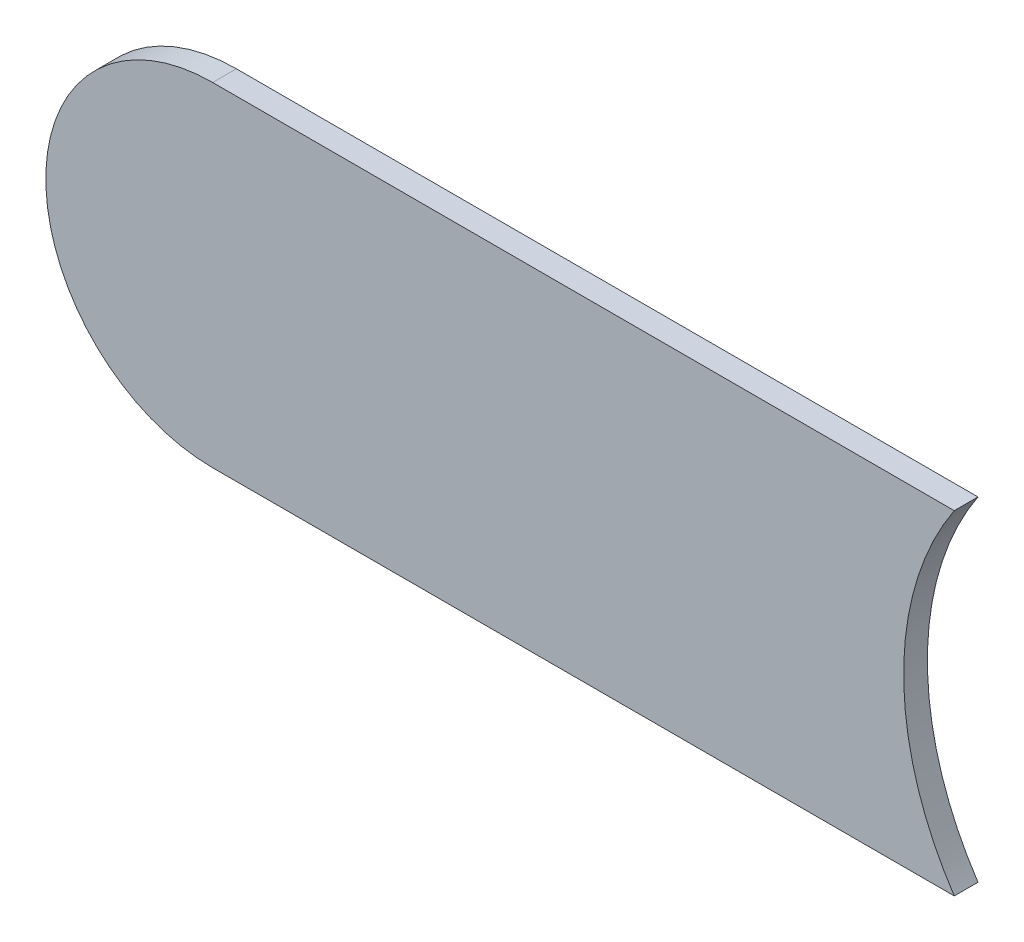
ISO-10303-21;
HEADER;
FILE_DESCRIPTION(('STEP AP214'),'2;1');
FILE_NAME('part.step','',(''),(''),'','','');
FILE_SCHEMA(('AUTOMOTIVE_DESIGN { 1 0 10303 214 1 1 1 1 }'));
ENDSEC;
DATA;
#1=APPLICATION_CONTEXT('core data for automotive mechanical design processes');
#2=APPLICATION_PROTOCOL_DEFINITION('international standard','automotive_design',2000,#1);
#3=PRODUCT_CONTEXT('',#1,'mechanical');
#4=PRODUCT('Part','Part','',(#3));
#5=PRODUCT_RELATED_PRODUCT_CATEGORY('part','',(#4));
#6=PRODUCT_DEFINITION_FORMATION('','',#4);
#7=PRODUCT_DEFINITION_CONTEXT('part definition',#1,'design');
#8=PRODUCT_DEFINITION('design','',#6,#7);
#9=PRODUCT_DEFINITION_SHAPE('','',#8);
#10=(LENGTH_UNIT() NAMED_UNIT(*) SI_UNIT(.MILLI.,.METRE.));
#11=(NAMED_UNIT(*) PLANE_ANGLE_UNIT() SI_UNIT($,.RADIAN.));
#12=(NAMED_UNIT(*) SI_UNIT($,.STERADIAN.) SOLID_ANGLE_UNIT());
#13=UNCERTAINTY_MEASURE_WITH_UNIT(LENGTH_MEASURE(1.E-05),#10,'distance_accuracy_value','');
#14=(GEOMETRIC_REPRESENTATION_CONTEXT(3) GLOBAL_UNCERTAINTY_ASSIGNED_CONTEXT((#13)) GLOBAL_UNIT_ASSIGNED_CONTEXT((#10,
#11,#12)) REPRESENTATION_CONTEXT('',''));
#15=CARTESIAN_POINT('',(0.,0.,0.));
#16=DIRECTION('',(0.,0.,1.));
#17=DIRECTION('',(1.,0.,0.));
#18=AXIS2_PLACEMENT_3D('',#15,#16,#17);
#19=CARTESIAN_POINT('',(88.9145796,87.7099973,0.));
#20=DIRECTION('',(0.,1.,0.));
#21=DIRECTION('',(1.,0.,0.));
#22=AXIS2_PLACEMENT_3D('',#19,#20,#21);
#23=PLANE('',#22);
#24=DIRECTION('',(1.,0.,0.));
#25=VECTOR('',#24,1.);
#26=CARTESIAN_POINT('',(88.9145796,87.7099973,0.03556));
#27=LINE('',#26,#25);
#28=CARTESIAN_POINT('',(88.9145796,87.7099973,0.03556));
#29=VERTEX_POINT('',#28);
#30=CARTESIAN_POINT('',(90.0258574096541,87.7099973,0.03556));
#31=VERTEX_POINT('',#30);
#32=EDGE_CURVE('E11',#29,#31,#27,.T.);
#33=ORIENTED_EDGE('',*,*,#32,.F.);
#34=DIRECTION('',(0.,0.,1.));
#35=VECTOR('',#34,1.);
#36=CARTESIAN_POINT('',(88.9145796,87.7099973,0.));
#37=LINE('',#36,#35);
#38=CARTESIAN_POINT('',(88.9145796,87.7099973,0.));
#39=VERTEX_POINT('',#38);
#40=EDGE_CURVE('E24',#39,#29,#37,.T.);
#41=ORIENTED_EDGE('',*,*,#40,.F.);
#42=DIRECTION('',(1.,0.,0.));
#43=VECTOR('',#42,1.);
#44=CARTESIAN_POINT('',(88.9145796,87.7099973,0.));
#45=LINE('',#44,#43);
#46=CARTESIAN_POINT('',(90.0258574096541,87.7099973,0.));
#47=VERTEX_POINT('',#46);
#48=EDGE_CURVE('E75',#39,#47,#45,.T.);
#49=ORIENTED_EDGE('',*,*,#48,.T.);
#50=DIRECTION('',(0.,0.,1.));
#51=VECTOR('',#50,1.);
#52=CARTESIAN_POINT('',(90.0258574096541,87.7099973,0.));
#53=LINE('',#52,#51);
#54=EDGE_CURVE('E37',#47,#31,#53,.T.);
#55=ORIENTED_EDGE('',*,*,#54,.T.);
#56=EDGE_LOOP('',(#33,#41,#49,#55));
#57=FACE_BOUND('',#56,.T.);
#58=ADVANCED_FACE('F17',(#57),#23,.F.);
#59=CARTESIAN_POINT('',(90.4000224,87.9599968,0.));
#60=DIRECTION('',(0.,0.,-1.));
#61=DIRECTION('',(1.,0.,0.));
#62=AXIS2_PLACEMENT_3D('',#59,#60,#61);
#63=CYLINDRICAL_SURFACE('',#62,0.4499991);
#64=DIRECTION('',(0.,0.,1.));
#65=VECTOR('',#64,1.);
#66=CARTESIAN_POINT('',(90.0258574096541,88.2099963,0.));
#67=LINE('',#66,#65);
#68=CARTESIAN_POINT('',(90.0258574096541,88.2099963,0.));
#69=VERTEX_POINT('',#68);
#70=CARTESIAN_POINT('',(90.0258574096541,88.2099963,0.03556));
#71=VERTEX_POINT('',#70);
#72=EDGE_CURVE('E67',#69,#71,#67,.T.);
#73=ORIENTED_EDGE('',*,*,#72,.T.);
#74=CARTESIAN_POINT('',(90.4000224,87.9599968,0.03556));
#75=DIRECTION('',(0.,0.,1.));
#76=DIRECTION('',(1.,0.,0.));
#77=AXIS2_PLACEMENT_3D('',#74,#75,#76);
#78=CIRCLE('',#77,0.4499991);
#79=EDGE_CURVE('E82',#71,#31,#78,.T.);
#80=ORIENTED_EDGE('',*,*,#79,.T.);
#81=ORIENTED_EDGE('',*,*,#54,.F.);
#82=CARTESIAN_POINT('',(90.4000224,87.9599968,0.));
#83=DIRECTION('',(0.,0.,1.));
#84=DIRECTION('',(1.,0.,0.));
#85=AXIS2_PLACEMENT_3D('',#82,#83,#84);
#86=CIRCLE('',#85,0.4499991);
#87=EDGE_CURVE('E80',#69,#47,#86,.T.);
#88=ORIENTED_EDGE('',*,*,#87,.F.);
#89=EDGE_LOOP('',(#73,#80,#81,#88));
#90=FACE_BOUND('',#89,.T.);
#91=ADVANCED_FACE('F88',(#90),#63,.F.);
#92=CARTESIAN_POINT('',(90.0258574096541,88.2099963,0.));
#93=DIRECTION('',(0.,-1.,0.));
#94=DIRECTION('',(-1.,0.,0.));
#95=AXIS2_PLACEMENT_3D('',#92,#93,#94);
#96=PLANE('',#95);
#97=DIRECTION('',(-1.,0.,0.));
#98=VECTOR('',#97,1.);
#99=CARTESIAN_POINT('',(90.4000224,88.2099963,0.03556));
#100=LINE('',#99,#98);
#101=CARTESIAN_POINT('',(88.9145796,88.2099963,0.03556));
#102=VERTEX_POINT('',#101);
#103=EDGE_CURVE('E71',#71,#102,#100,.T.);
#104=ORIENTED_EDGE('',*,*,#103,.F.);
#105=ORIENTED_EDGE('',*,*,#72,.F.);
#106=DIRECTION('',(-1.,0.,0.));
#107=VECTOR('',#106,1.);
#108=CARTESIAN_POINT('',(90.4000224,88.2099963,0.));
#109=LINE('',#108,#107);
#110=CARTESIAN_POINT('',(88.9145796,88.2099963,0.));
#111=VERTEX_POINT('',#110);
#112=EDGE_CURVE('E63',#69,#111,#109,.T.);
#113=ORIENTED_EDGE('',*,*,#112,.T.);
#114=DIRECTION('',(0.,0.,1.));
#115=VECTOR('',#114,1.);
#116=CARTESIAN_POINT('',(88.9145796,88.2099963,0.));
#117=LINE('',#116,#115);
#118=EDGE_CURVE('E53',#111,#102,#117,.T.);
#119=ORIENTED_EDGE('',*,*,#118,.T.);
#120=EDGE_LOOP('',(#104,#105,#113,#119));
#121=FACE_BOUND('',#120,.T.);
#122=ADVANCED_FACE('F66',(#121),#96,.F.);
#123=CARTESIAN_POINT('',(88.9145796,87.9599968,0.));
#124=DIRECTION('',(0.,0.,-1.));
#125=DIRECTION('',(0.,1.,0.));
#126=AXIS2_PLACEMENT_3D('',#123,#124,#125);
#127=CYLINDRICAL_SURFACE('',#126,0.249999500000001);
#128=CARTESIAN_POINT('',(88.9145796,87.9599968,0.03556));
#129=DIRECTION('',(0.,0.,1.));
#130=DIRECTION('',(0.,1.,0.));
#131=AXIS2_PLACEMENT_3D('',#128,#129,#130);
#132=CIRCLE('',#131,0.249999500000001);
#133=EDGE_CURVE('E59',#102,#29,#132,.T.);
#134=ORIENTED_EDGE('',*,*,#133,.F.);
#135=ORIENTED_EDGE('',*,*,#118,.F.);
#136=CARTESIAN_POINT('',(88.9145796,87.9599968,0.));
#137=DIRECTION('',(0.,0.,1.));
#138=DIRECTION('',(0.,1.,0.));
#139=AXIS2_PLACEMENT_3D('',#136,#137,#138);
#140=CIRCLE('',#139,0.249999500000001);
#141=EDGE_CURVE('E57',#111,#39,#140,.T.);
#142=ORIENTED_EDGE('',*,*,#141,.T.);
#143=ORIENTED_EDGE('',*,*,#40,.T.);
#144=EDGE_LOOP('',(#134,#135,#142,#143));
#145=FACE_BOUND('',#144,.T.);
#146=ADVANCED_FACE('F55',(#145),#127,.T.);
#147=CARTESIAN_POINT('',(88.9145796,87.7099973,0.));
#148=DIRECTION('',(0.,0.,-1.));
#149=DIRECTION('',(-1.,0.,0.));
#150=AXIS2_PLACEMENT_3D('',#147,#148,#149);
#151=PLANE('',#150);
#152=ORIENTED_EDGE('',*,*,#48,.F.);
#153=ORIENTED_EDGE('',*,*,#141,.F.);
#154=ORIENTED_EDGE('',*,*,#112,.F.);
#155=ORIENTED_EDGE('',*,*,#87,.T.);
#156=EDGE_LOOP('',(#152,#153,#154,#155));
#157=FACE_BOUND('',#156,.T.);
#158=ADVANCED_FACE('F74',(#157),#151,.T.);
#159=CARTESIAN_POINT('',(88.9145796,87.7099973,0.03556));
#160=DIRECTION('',(0.,0.,-1.));
#161=DIRECTION('',(-1.,0.,0.));
#162=AXIS2_PLACEMENT_3D('',#159,#160,#161);
#163=PLANE('',#162);
#164=ORIENTED_EDGE('',*,*,#133,.T.);
#165=ORIENTED_EDGE('',*,*,#32,.T.);
#166=ORIENTED_EDGE('',*,*,#79,.F.);
#167=ORIENTED_EDGE('',*,*,#103,.T.);
#168=EDGE_LOOP('',(#164,#165,#166,#167));
#169=FACE_BOUND('',#168,.T.);
#170=ADVANCED_FACE('F91',(#169),#163,.F.);
#171=CLOSED_SHELL('',(#58,#91,#122,#146,#158,#170));
#172=MANIFOLD_SOLID_BREP('B1',#171);
#173=ADVANCED_BREP_SHAPE_REPRESENTATION('',(#18,#172),#14);
#174=SHAPE_DEFINITION_REPRESENTATION(#9,#173);
ENDSEC;
END-ISO-10303-21;
